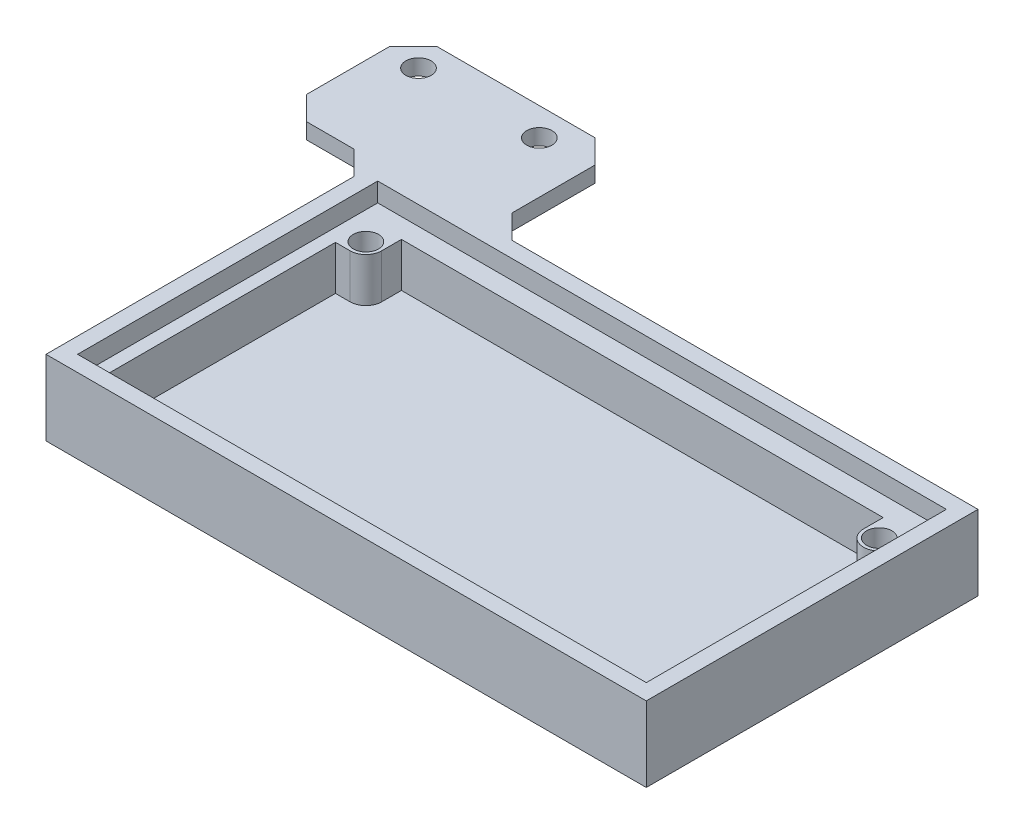
ISO-10303-21;
HEADER;
FILE_DESCRIPTION(('STEP AP214'),'2;1');
FILE_NAME('part.step','',(''),(''),'','','');
FILE_SCHEMA(('AUTOMOTIVE_DESIGN { 1 0 10303 214 1 1 1 1 }'));
ENDSEC;
DATA;
#1=APPLICATION_CONTEXT('core data for automotive mechanical design processes');
#2=APPLICATION_PROTOCOL_DEFINITION('international standard','automotive_design',2000,#1);
#3=PRODUCT_CONTEXT('',#1,'mechanical');
#4=PRODUCT('Part','Part','',(#3));
#5=PRODUCT_RELATED_PRODUCT_CATEGORY('part','',(#4));
#6=PRODUCT_DEFINITION_FORMATION('','',#4);
#7=PRODUCT_DEFINITION_CONTEXT('part definition',#1,'design');
#8=PRODUCT_DEFINITION('design','',#6,#7);
#9=PRODUCT_DEFINITION_SHAPE('','',#8);
#10=(LENGTH_UNIT() NAMED_UNIT(*) SI_UNIT(.MILLI.,.METRE.));
#11=(NAMED_UNIT(*) PLANE_ANGLE_UNIT() SI_UNIT($,.RADIAN.));
#12=(NAMED_UNIT(*) SI_UNIT($,.STERADIAN.) SOLID_ANGLE_UNIT());
#13=UNCERTAINTY_MEASURE_WITH_UNIT(LENGTH_MEASURE(1.E-05),#10,'distance_accuracy_value','');
#14=(GEOMETRIC_REPRESENTATION_CONTEXT(3) GLOBAL_UNCERTAINTY_ASSIGNED_CONTEXT((#13)) GLOBAL_UNIT_ASSIGNED_CONTEXT((#10,
#11,#12)) REPRESENTATION_CONTEXT('',''));
#15=CARTESIAN_POINT('',(0.,0.,0.));
#16=DIRECTION('',(0.,0.,1.));
#17=DIRECTION('',(1.,0.,0.));
#18=AXIS2_PLACEMENT_3D('',#15,#16,#17);
#19=CARTESIAN_POINT('',(-38.,8.,-21.));
#20=DIRECTION('',(0.,0.,1.));
#21=DIRECTION('',(1.,0.,0.));
#22=AXIS2_PLACEMENT_3D('',#19,#20,#21);
#23=PLANE('',#22);
#24=DIRECTION('',(1.,0.,0.));
#25=VECTOR('',#24,1.);
#26=CARTESIAN_POINT('',(-24.,3.00000000000001,-21.));
#27=LINE('',#26,#25);
#28=CARTESIAN_POINT('',(-38.,3.00000000000001,-21.));
#29=VERTEX_POINT('',#28);
#30=CARTESIAN_POINT('',(-21.,3.00000000000001,-21.));
#31=VERTEX_POINT('',#30);
#32=EDGE_CURVE('E410',#29,#31,#27,.T.);
#33=ORIENTED_EDGE('',*,*,#32,.T.);
#34=DIRECTION('',(0.,1.,0.));
#35=VECTOR('',#34,1.);
#36=CARTESIAN_POINT('',(-21.,8.,-21.));
#37=LINE('',#36,#35);
#38=CARTESIAN_POINT('',(-21.,8.,-21.));
#39=VERTEX_POINT('',#38);
#40=EDGE_CURVE('E419',#31,#39,#37,.T.);
#41=ORIENTED_EDGE('',*,*,#40,.T.);
#42=DIRECTION('',(-1.,0.,0.));
#43=VECTOR('',#42,1.);
#44=CARTESIAN_POINT('',(-38.,8.,-21.));
#45=LINE('',#44,#43);
#46=CARTESIAN_POINT('',(38.,8.,-21.));
#47=VERTEX_POINT('',#46);
#48=EDGE_CURVE('E392',#47,#39,#45,.T.);
#49=ORIENTED_EDGE('',*,*,#48,.F.);
#50=DIRECTION('',(0.,-1.,0.));
#51=VECTOR('',#50,1.);
#52=CARTESIAN_POINT('',(38.,8.,-21.));
#53=LINE('',#52,#51);
#54=CARTESIAN_POINT('',(38.,-1.5,-21.));
#55=VERTEX_POINT('',#54);
#56=EDGE_CURVE('E401',#47,#55,#53,.T.);
#57=ORIENTED_EDGE('',*,*,#56,.T.);
#58=DIRECTION('',(1.,0.,0.));
#59=VECTOR('',#58,1.);
#60=CARTESIAN_POINT('',(-38.,-1.5,-21.));
#61=LINE('',#60,#59);
#62=CARTESIAN_POINT('',(-38.,-1.5,-21.));
#63=VERTEX_POINT('',#62);
#64=EDGE_CURVE('E360',#63,#55,#61,.T.);
#65=ORIENTED_EDGE('',*,*,#64,.F.);
#66=DIRECTION('',(0.,-1.,0.));
#67=VECTOR('',#66,1.);
#68=CARTESIAN_POINT('',(-38.,8.,-21.));
#69=LINE('',#68,#67);
#70=EDGE_CURVE('E399',#29,#63,#69,.T.);
#71=ORIENTED_EDGE('',*,*,#70,.F.);
#72=EDGE_LOOP('',(#33,#41,#49,#57,#65,#71));
#73=FACE_BOUND('',#72,.T.);
#74=ADVANCED_FACE('F94',(#73),#23,.F.);
#75=CARTESIAN_POINT('',(-36.,8.,19.));
#76=DIRECTION('',(0.,0.,-1.));
#77=DIRECTION('',(-1.,0.,0.));
#78=AXIS2_PLACEMENT_3D('',#75,#76,#77);
#79=PLANE('',#78);
#80=DIRECTION('',(1.,0.,0.));
#81=VECTOR('',#80,1.);
#82=CARTESIAN_POINT('',(-36.,0.,19.));
#83=LINE('',#82,#81);
#84=CARTESIAN_POINT('',(-34.35,0.,19.));
#85=VERTEX_POINT('',#84);
#86=CARTESIAN_POINT('',(34.35,0.,19.));
#87=VERTEX_POINT('',#86);
#88=EDGE_CURVE('E363',#85,#87,#83,.T.);
#89=ORIENTED_EDGE('',*,*,#88,.F.);
#90=DIRECTION('',(0.,1.,0.));
#91=VECTOR('',#90,1.);
#92=CARTESIAN_POINT('',(-34.35,-82.9125297481905,19.));
#93=LINE('',#92,#91);
#94=CARTESIAN_POINT('',(-34.35,5.6,19.));
#95=VERTEX_POINT('',#94);
#96=EDGE_CURVE('E324',#85,#95,#93,.T.);
#97=ORIENTED_EDGE('',*,*,#96,.T.);
#98=DIRECTION('',(-1.,0.,0.));
#99=VECTOR('',#98,1.);
#100=CARTESIAN_POINT('',(0.,5.6,19.));
#101=LINE('',#100,#99);
#102=CARTESIAN_POINT('',(-36.,5.6,19.));
#103=VERTEX_POINT('',#102);
#104=EDGE_CURVE('E323',#95,#103,#101,.T.);
#105=ORIENTED_EDGE('',*,*,#104,.T.);
#106=DIRECTION('',(0.,-1.,0.));
#107=VECTOR('',#106,1.);
#108=CARTESIAN_POINT('',(-36.,8.,19.));
#109=LINE('',#108,#107);
#110=CARTESIAN_POINT('',(-36.,8.,19.));
#111=VERTEX_POINT('',#110);
#112=EDGE_CURVE('E378',#111,#103,#109,.T.);
#113=ORIENTED_EDGE('',*,*,#112,.F.);
#114=DIRECTION('',(1.,0.,0.));
#115=VECTOR('',#114,1.);
#116=CARTESIAN_POINT('',(-36.,8.,19.));
#117=LINE('',#116,#115);
#118=CARTESIAN_POINT('',(36.,8.,19.));
#119=VERTEX_POINT('',#118);
#120=EDGE_CURVE('E371',#111,#119,#117,.T.);
#121=ORIENTED_EDGE('',*,*,#120,.T.);
#122=DIRECTION('',(0.,-1.,0.));
#123=VECTOR('',#122,1.);
#124=CARTESIAN_POINT('',(36.,8.,19.));
#125=LINE('',#124,#123);
#126=CARTESIAN_POINT('',(36.,5.6,19.));
#127=VERTEX_POINT('',#126);
#128=EDGE_CURVE('E373',#119,#127,#125,.T.);
#129=ORIENTED_EDGE('',*,*,#128,.T.);
#130=DIRECTION('',(-1.,0.,0.));
#131=VECTOR('',#130,1.);
#132=CARTESIAN_POINT('',(0.,5.6,19.));
#133=LINE('',#132,#131);
#134=CARTESIAN_POINT('',(34.35,5.6,19.));
#135=VERTEX_POINT('',#134);
#136=EDGE_CURVE('E330',#127,#135,#133,.T.);
#137=ORIENTED_EDGE('',*,*,#136,.T.);
#138=DIRECTION('',(0.,1.,0.));
#139=VECTOR('',#138,1.);
#140=CARTESIAN_POINT('',(34.35,-82.9125297481905,19.));
#141=LINE('',#140,#139);
#142=EDGE_CURVE('E328',#87,#135,#141,.T.);
#143=ORIENTED_EDGE('',*,*,#142,.F.);
#144=EDGE_LOOP('',(#89,#97,#105,#113,#121,#129,#137,#143));
#145=FACE_BOUND('',#144,.T.);
#146=ADVANCED_FACE('F527',(#145),#79,.T.);
#147=CARTESIAN_POINT('',(0.,0.,0.));
#148=DIRECTION('',(0.,-1.,0.));
#149=DIRECTION('',(0.,0.,-1.));
#150=AXIS2_PLACEMENT_3D('',#147,#148,#149);
#151=PLANE('',#150);
#152=DIRECTION('',(0.,0.,-1.));
#153=VECTOR('',#152,1.);
#154=CARTESIAN_POINT('',(-34.35,0.,0.));
#155=LINE('',#154,#153);
#156=CARTESIAN_POINT('',(-34.35,0.,-12.));
#157=VERTEX_POINT('',#156);
#158=EDGE_CURVE('E335',#85,#157,#155,.T.);
#159=ORIENTED_EDGE('',*,*,#158,.F.);
#160=ORIENTED_EDGE('',*,*,#88,.T.);
#161=DIRECTION('',(0.,0.,-1.));
#162=VECTOR('',#161,1.);
#163=CARTESIAN_POINT('',(34.35,0.,0.));
#164=LINE('',#163,#162);
#165=CARTESIAN_POINT('',(34.35,0.,-13.2400657923215));
#166=VERTEX_POINT('',#165);
#167=EDGE_CURVE('E348',#87,#166,#164,.T.);
#168=ORIENTED_EDGE('',*,*,#167,.T.);
#169=CARTESIAN_POINT('',(32.5,0.,-14.));
#170=DIRECTION('',(0.,-1.,0.));
#171=DIRECTION('',(0.,0.,-1.));
#172=AXIS2_PLACEMENT_3D('',#169,#170,#171);
#173=CIRCLE('',#172,2.);
#174=CARTESIAN_POINT('',(30.5,0.,-14.));
#175=VERTEX_POINT('',#174);
#176=EDGE_CURVE('E332',#166,#175,#173,.T.);
#177=ORIENTED_EDGE('',*,*,#176,.T.);
#178=DIRECTION('',(0.,0.,1.));
#179=VECTOR('',#178,1.);
#180=CARTESIAN_POINT('',(30.5,0.,0.));
#181=LINE('',#180,#179);
#182=CARTESIAN_POINT('',(30.5,0.,-16.5));
#183=VERTEX_POINT('',#182);
#184=EDGE_CURVE('E283',#183,#175,#181,.T.);
#185=ORIENTED_EDGE('',*,*,#184,.F.);
#186=DIRECTION('',(-1.,0.,0.));
#187=VECTOR('',#186,1.);
#188=CARTESIAN_POINT('',(0.,0.,-16.5));
#189=LINE('',#188,#187);
#190=CARTESIAN_POINT('',(-30.5,0.,-16.5));
#191=VERTEX_POINT('',#190);
#192=EDGE_CURVE('E345',#183,#191,#189,.T.);
#193=ORIENTED_EDGE('',*,*,#192,.T.);
#194=DIRECTION('',(0.,0.,1.));
#195=VECTOR('',#194,1.);
#196=CARTESIAN_POINT('',(-30.5,0.,0.));
#197=LINE('',#196,#195);
#198=CARTESIAN_POINT('',(-30.5,0.,-14.));
#199=VERTEX_POINT('',#198);
#200=EDGE_CURVE('E342',#191,#199,#197,.T.);
#201=ORIENTED_EDGE('',*,*,#200,.T.);
#202=CARTESIAN_POINT('',(-32.5,0.,-14.));
#203=DIRECTION('',(0.,-1.,0.));
#204=DIRECTION('',(0.,0.,-1.));
#205=AXIS2_PLACEMENT_3D('',#202,#203,#204);
#206=CIRCLE('',#205,2.);
#207=CARTESIAN_POINT('',(-32.5,0.,-12.));
#208=VERTEX_POINT('',#207);
#209=EDGE_CURVE('E339',#199,#208,#206,.T.);
#210=ORIENTED_EDGE('',*,*,#209,.T.);
#211=DIRECTION('',(1.,0.,0.));
#212=VECTOR('',#211,1.);
#213=CARTESIAN_POINT('',(0.,0.,-12.));
#214=LINE('',#213,#212);
#215=EDGE_CURVE('E337',#157,#208,#214,.T.);
#216=ORIENTED_EDGE('',*,*,#215,.F.);
#217=EDGE_LOOP('',(#159,#160,#168,#177,#185,#193,#201,#210,#216));
#218=FACE_BOUND('',#217,.T.);
#219=ADVANCED_FACE('F549',(#218),#151,.F.);
#220=CARTESIAN_POINT('',(0.,8.,0.));
#221=DIRECTION('',(0.,1.,0.));
#222=DIRECTION('',(0.,0.,1.));
#223=AXIS2_PLACEMENT_3D('',#220,#221,#222);
#224=PLANE('',#223);
#225=CARTESIAN_POINT('',(-30.5,8.,-33.96));
#226=DIRECTION('',(0.,1.,0.));
#227=DIRECTION('',(0.,0.,1.));
#228=AXIS2_PLACEMENT_3D('',#225,#226,#227);
#229=CIRCLE('',#228,1.6);
#230=CARTESIAN_POINT('',(-30.5,8.,-32.36));
#231=VERTEX_POINT('',#230);
#232=EDGE_CURVE('E460',#231,#231,#229,.T.);
#233=ORIENTED_EDGE('',*,*,#232,.F.);
#234=EDGE_LOOP('',(#233));
#235=FACE_BOUND('',#234,.T.);
#236=CARTESIAN_POINT('',(-45.8,8.,-33.96));
#237=DIRECTION('',(0.,1.,0.));
#238=DIRECTION('',(0.,0.,1.));
#239=AXIS2_PLACEMENT_3D('',#236,#237,#238);
#240=CIRCLE('',#239,1.6);
#241=CARTESIAN_POINT('',(-45.8,8.,-32.36));
#242=VERTEX_POINT('',#241);
#243=EDGE_CURVE('E456',#242,#242,#240,.T.);
#244=ORIENTED_EDGE('',*,*,#243,.F.);
#245=EDGE_LOOP('',(#244));
#246=FACE_BOUND('',#245,.T.);
#247=DIRECTION('',(0.,0.,1.));
#248=VECTOR('',#247,1.);
#249=CARTESIAN_POINT('',(-24.,8.,-37.5));
#250=LINE('',#249,#248);
#251=CARTESIAN_POINT('',(-24.,8.,-34.5));
#252=VERTEX_POINT('',#251);
#253=CARTESIAN_POINT('',(-24.,8.,-24.0000000000001));
#254=VERTEX_POINT('',#253);
#255=EDGE_CURVE('E487',#252,#254,#250,.T.);
#256=ORIENTED_EDGE('',*,*,#255,.F.);
#257=DIRECTION('',(0.707106781186546,0.,0.707106781186549));
#258=VECTOR('',#257,1.);
#259=CARTESIAN_POINT('',(5.24999999999993,8.,-5.24999999999991));
#260=LINE('',#259,#258);
#261=CARTESIAN_POINT('',(-27.,8.,-37.5));
#262=VERTEX_POINT('',#261);
#263=EDGE_CURVE('E437',#252,#262,#260,.F.);
#264=ORIENTED_EDGE('',*,*,#263,.T.);
#265=DIRECTION('',(1.,0.,0.));
#266=VECTOR('',#265,1.);
#267=CARTESIAN_POINT('',(-24.,8.,-37.5));
#268=LINE('',#267,#266);
#269=CARTESIAN_POINT('',(-47.,8.,-37.5));
#270=VERTEX_POINT('',#269);
#271=EDGE_CURVE('E482',#270,#262,#268,.T.);
#272=ORIENTED_EDGE('',*,*,#271,.F.);
#273=DIRECTION('',(0.707106781186544,0.,-0.707106781186551));
#274=VECTOR('',#273,1.);
#275=CARTESIAN_POINT('',(-42.2500000000002,8.,-42.2499999999998));
#276=LINE('',#275,#274);
#277=CARTESIAN_POINT('',(-50.,8.,-34.5));
#278=VERTEX_POINT('',#277);
#279=EDGE_CURVE('E435',#270,#278,#276,.F.);
#280=ORIENTED_EDGE('',*,*,#279,.T.);
#281=DIRECTION('',(0.,0.,1.));
#282=VECTOR('',#281,1.);
#283=CARTESIAN_POINT('',(-50.,8.,-37.5));
#284=LINE('',#283,#282);
#285=CARTESIAN_POINT('',(-50.,8.,-24.));
#286=VERTEX_POINT('',#285);
#287=EDGE_CURVE('E490',#278,#286,#284,.T.);
#288=ORIENTED_EDGE('',*,*,#287,.T.);
#289=DIRECTION('',(0.707106781186549,0.,0.707106781186546));
#290=VECTOR('',#289,1.);
#291=CARTESIAN_POINT('',(-12.9999999999999,8.,12.9999999999999));
#292=LINE('',#291,#290);
#293=CARTESIAN_POINT('',(-47.,8.,-21.));
#294=VERTEX_POINT('',#293);
#295=EDGE_CURVE('E433',#286,#294,#292,.T.);
#296=ORIENTED_EDGE('',*,*,#295,.T.);
#297=DIRECTION('',(1.,0.,0.));
#298=VECTOR('',#297,1.);
#299=CARTESIAN_POINT('',(-24.,8.,-21.));
#300=LINE('',#299,#298);
#301=CARTESIAN_POINT('',(-41.,8.,-21.));
#302=VERTEX_POINT('',#301);
#303=EDGE_CURVE('E475',#294,#302,#300,.T.);
#304=ORIENTED_EDGE('',*,*,#303,.T.);
#305=DIRECTION('',(0.707106781186544,0.,0.707106781186551));
#306=VECTOR('',#305,1.);
#307=CARTESIAN_POINT('',(-38.,8.,-18.));
#308=LINE('',#307,#306);
#309=CARTESIAN_POINT('',(-38.,8.,-18.));
#310=VERTEX_POINT('',#309);
#311=EDGE_CURVE('E12',#302,#310,#308,.T.);
#312=ORIENTED_EDGE('',*,*,#311,.T.);
#313=DIRECTION('',(0.,0.,1.));
#314=VECTOR('',#313,1.);
#315=CARTESIAN_POINT('',(-38.,8.,21.));
#316=LINE('',#315,#314);
#317=CARTESIAN_POINT('',(-38.,8.,21.));
#318=VERTEX_POINT('',#317);
#319=EDGE_CURVE('E395',#310,#318,#316,.T.);
#320=ORIENTED_EDGE('',*,*,#319,.T.);
#321=DIRECTION('',(1.,0.,0.));
#322=VECTOR('',#321,1.);
#323=CARTESIAN_POINT('',(-38.,8.,21.));
#324=LINE('',#323,#322);
#325=CARTESIAN_POINT('',(38.,8.,21.));
#326=VERTEX_POINT('',#325);
#327=EDGE_CURVE('E387',#318,#326,#324,.T.);
#328=ORIENTED_EDGE('',*,*,#327,.T.);
#329=DIRECTION('',(0.,0.,-1.));
#330=VECTOR('',#329,1.);
#331=CARTESIAN_POINT('',(38.,8.,21.));
#332=LINE('',#331,#330);
#333=EDGE_CURVE('E390',#326,#47,#332,.T.);
#334=ORIENTED_EDGE('',*,*,#333,.T.);
#335=ORIENTED_EDGE('',*,*,#48,.T.);
#336=DIRECTION('',(0.707106781186544,0.,0.707106781186551));
#337=VECTOR('',#336,1.);
#338=CARTESIAN_POINT('',(-24.,8.,-24.0000000000001));
#339=LINE('',#338,#337);
#340=EDGE_CURVE('E450',#39,#254,#339,.F.);
#341=ORIENTED_EDGE('',*,*,#340,.T.);
#342=EDGE_LOOP('',(#256,#264,#272,#280,#288,#296,#304,#312,#320,#328,#334,#335,#341));
#343=FACE_BOUND('',#342,.T.);
#344=DIRECTION('',(-1.,0.,0.));
#345=VECTOR('',#344,1.);
#346=CARTESIAN_POINT('',(-36.,8.,-19.));
#347=LINE('',#346,#345);
#348=CARTESIAN_POINT('',(36.,8.,-19.));
#349=VERTEX_POINT('',#348);
#350=CARTESIAN_POINT('',(-36.,8.,-19.));
#351=VERTEX_POINT('',#350);
#352=EDGE_CURVE('E366',#349,#351,#347,.T.);
#353=ORIENTED_EDGE('',*,*,#352,.F.);
#354=DIRECTION('',(0.,0.,-1.));
#355=VECTOR('',#354,1.);
#356=CARTESIAN_POINT('',(36.,8.,19.));
#357=LINE('',#356,#355);
#358=EDGE_CURVE('E364',#119,#349,#357,.T.);
#359=ORIENTED_EDGE('',*,*,#358,.F.);
#360=ORIENTED_EDGE('',*,*,#120,.F.);
#361=DIRECTION('',(0.,0.,1.));
#362=VECTOR('',#361,1.);
#363=CARTESIAN_POINT('',(-36.,8.,19.));
#364=LINE('',#363,#362);
#365=EDGE_CURVE('E368',#351,#111,#364,.T.);
#366=ORIENTED_EDGE('',*,*,#365,.F.);
#367=EDGE_LOOP('',(#353,#359,#360,#366));
#368=FACE_BOUND('',#367,.T.);
#369=ADVANCED_FACE('F473',(#235,#246,#343,#368),#224,.T.);
#370=CARTESIAN_POINT('',(-38.,8.,21.));
#371=DIRECTION('',(0.,0.,-1.));
#372=DIRECTION('',(-1.,0.,0.));
#373=AXIS2_PLACEMENT_3D('',#370,#371,#372);
#374=PLANE('',#373);
#375=DIRECTION('',(0.,-1.,0.));
#376=VECTOR('',#375,1.);
#377=CARTESIAN_POINT('',(-38.,8.,21.));
#378=LINE('',#377,#376);
#379=CARTESIAN_POINT('',(-38.,-1.5,21.));
#380=VERTEX_POINT('',#379);
#381=EDGE_CURVE('E397',#318,#380,#378,.T.);
#382=ORIENTED_EDGE('',*,*,#381,.T.);
#383=DIRECTION('',(-1.,0.,0.));
#384=VECTOR('',#383,1.);
#385=CARTESIAN_POINT('',(38.,-1.5,21.));
#386=LINE('',#385,#384);
#387=CARTESIAN_POINT('',(38.,-1.5,21.));
#388=VERTEX_POINT('',#387);
#389=EDGE_CURVE('E354',#388,#380,#386,.T.);
#390=ORIENTED_EDGE('',*,*,#389,.F.);
#391=DIRECTION('',(0.,-1.,0.));
#392=VECTOR('',#391,1.);
#393=CARTESIAN_POINT('',(38.,8.,21.));
#394=LINE('',#393,#392);
#395=EDGE_CURVE('E403',#326,#388,#394,.T.);
#396=ORIENTED_EDGE('',*,*,#395,.F.);
#397=ORIENTED_EDGE('',*,*,#327,.F.);
#398=EDGE_LOOP('',(#382,#390,#396,#397));
#399=FACE_BOUND('',#398,.T.);
#400=ADVANCED_FACE('F592',(#399),#374,.F.);
#401=CARTESIAN_POINT('',(38.,8.,21.));
#402=DIRECTION('',(-1.,0.,0.));
#403=DIRECTION('',(0.,0.,1.));
#404=AXIS2_PLACEMENT_3D('',#401,#402,#403);
#405=PLANE('',#404);
#406=ORIENTED_EDGE('',*,*,#395,.T.);
#407=DIRECTION('',(0.,0.,1.));
#408=VECTOR('',#407,1.);
#409=CARTESIAN_POINT('',(38.,-1.5,-21.));
#410=LINE('',#409,#408);
#411=EDGE_CURVE('E351',#55,#388,#410,.T.);
#412=ORIENTED_EDGE('',*,*,#411,.F.);
#413=ORIENTED_EDGE('',*,*,#56,.F.);
#414=ORIENTED_EDGE('',*,*,#333,.F.);
#415=EDGE_LOOP('',(#406,#412,#413,#414));
#416=FACE_BOUND('',#415,.T.);
#417=ADVANCED_FACE('F589',(#416),#405,.F.);
#418=CARTESIAN_POINT('',(-38.,8.,21.));
#419=DIRECTION('',(1.,0.,0.));
#420=DIRECTION('',(0.,0.,-1.));
#421=AXIS2_PLACEMENT_3D('',#418,#419,#420);
#422=PLANE('',#421);
#423=ORIENTED_EDGE('',*,*,#319,.F.);
#424=DIRECTION('',(0.,-1.,0.));
#425=VECTOR('',#424,1.);
#426=CARTESIAN_POINT('',(-38.,8.,-18.));
#427=LINE('',#426,#425);
#428=CARTESIAN_POINT('',(-38.,6.,-18.));
#429=VERTEX_POINT('',#428);
#430=EDGE_CURVE('E452',#310,#429,#427,.T.);
#431=ORIENTED_EDGE('',*,*,#430,.T.);
#432=DIRECTION('',(0.,0.,1.));
#433=VECTOR('',#432,1.);
#434=CARTESIAN_POINT('',(-38.,6.,21.));
#435=LINE('',#434,#433);
#436=CARTESIAN_POINT('',(-38.,6.,-24.));
#437=VERTEX_POINT('',#436);
#438=EDGE_CURVE('E405',#437,#429,#435,.T.);
#439=ORIENTED_EDGE('',*,*,#438,.F.);
#440=DIRECTION('',(0.,0.707106781186544,-0.707106781186551));
#441=VECTOR('',#440,1.);
#442=CARTESIAN_POINT('',(-38.,-15.5,-2.4999999999998));
#443=LINE('',#442,#441);
#444=EDGE_CURVE('E412',#437,#29,#443,.F.);
#445=ORIENTED_EDGE('',*,*,#444,.T.);
#446=ORIENTED_EDGE('',*,*,#70,.T.);
#447=DIRECTION('',(0.,0.,-1.));
#448=VECTOR('',#447,1.);
#449=CARTESIAN_POINT('',(-38.,-1.5,21.));
#450=LINE('',#449,#448);
#451=EDGE_CURVE('E357',#380,#63,#450,.T.);
#452=ORIENTED_EDGE('',*,*,#451,.F.);
#453=ORIENTED_EDGE('',*,*,#381,.F.);
#454=EDGE_LOOP('',(#423,#431,#439,#445,#446,#452,#453));
#455=FACE_BOUND('',#454,.T.);
#456=ADVANCED_FACE('F467',(#455),#422,.F.);
#457=CARTESIAN_POINT('',(36.,8.,19.));
#458=DIRECTION('',(-1.,0.,0.));
#459=DIRECTION('',(0.,0.,1.));
#460=AXIS2_PLACEMENT_3D('',#457,#458,#459);
#461=PLANE('',#460);
#462=DIRECTION('',(0.,0.,1.));
#463=VECTOR('',#462,1.);
#464=CARTESIAN_POINT('',(36.,5.6,0.));
#465=LINE('',#464,#463);
#466=CARTESIAN_POINT('',(36.,5.6,-19.));
#467=VERTEX_POINT('',#466);
#468=EDGE_CURVE('E521',#467,#127,#465,.T.);
#469=ORIENTED_EDGE('',*,*,#468,.T.);
#470=ORIENTED_EDGE('',*,*,#128,.F.);
#471=ORIENTED_EDGE('',*,*,#358,.T.);
#472=DIRECTION('',(0.,-1.,0.));
#473=VECTOR('',#472,1.);
#474=CARTESIAN_POINT('',(36.,8.,-19.));
#475=LINE('',#474,#473);
#476=EDGE_CURVE('E384',#349,#467,#475,.T.);
#477=ORIENTED_EDGE('',*,*,#476,.T.);
#478=EDGE_LOOP('',(#469,#470,#471,#477));
#479=FACE_BOUND('',#478,.T.);
#480=ADVANCED_FACE('F530',(#479),#461,.T.);
#481=CARTESIAN_POINT('',(-36.,8.,-19.));
#482=DIRECTION('',(0.,0.,1.));
#483=DIRECTION('',(1.,0.,0.));
#484=AXIS2_PLACEMENT_3D('',#481,#482,#483);
#485=PLANE('',#484);
#486=DIRECTION('',(1.,0.,0.));
#487=VECTOR('',#486,1.);
#488=CARTESIAN_POINT('',(0.,5.6,-19.));
#489=LINE('',#488,#487);
#490=CARTESIAN_POINT('',(-36.,5.6,-19.));
#491=VERTEX_POINT('',#490);
#492=EDGE_CURVE('E518',#491,#467,#489,.T.);
#493=ORIENTED_EDGE('',*,*,#492,.T.);
#494=ORIENTED_EDGE('',*,*,#476,.F.);
#495=ORIENTED_EDGE('',*,*,#352,.T.);
#496=DIRECTION('',(0.,-1.,0.));
#497=VECTOR('',#496,1.);
#498=CARTESIAN_POINT('',(-36.,8.,-19.));
#499=LINE('',#498,#497);
#500=EDGE_CURVE('E381',#351,#491,#499,.T.);
#501=ORIENTED_EDGE('',*,*,#500,.T.);
#502=EDGE_LOOP('',(#493,#494,#495,#501));
#503=FACE_BOUND('',#502,.T.);
#504=ADVANCED_FACE('F535',(#503),#485,.T.);
#505=CARTESIAN_POINT('',(-36.,8.,19.));
#506=DIRECTION('',(1.,0.,0.));
#507=DIRECTION('',(0.,0.,-1.));
#508=AXIS2_PLACEMENT_3D('',#505,#506,#507);
#509=PLANE('',#508);
#510=DIRECTION('',(0.,0.,-1.));
#511=VECTOR('',#510,1.);
#512=CARTESIAN_POINT('',(-36.,5.6,0.));
#513=LINE('',#512,#511);
#514=EDGE_CURVE('E327',#103,#491,#513,.T.);
#515=ORIENTED_EDGE('',*,*,#514,.T.);
#516=ORIENTED_EDGE('',*,*,#500,.F.);
#517=ORIENTED_EDGE('',*,*,#365,.T.);
#518=ORIENTED_EDGE('',*,*,#112,.T.);
#519=EDGE_LOOP('',(#515,#516,#517,#518));
#520=FACE_BOUND('',#519,.T.);
#521=ADVANCED_FACE('F540',(#520),#509,.T.);
#522=CARTESIAN_POINT('',(0.,-1.5,0.));
#523=DIRECTION('',(0.,-1.,0.));
#524=DIRECTION('',(0.,0.,-1.));
#525=AXIS2_PLACEMENT_3D('',#522,#523,#524);
#526=PLANE('',#525);
#527=CARTESIAN_POINT('',(32.5,-1.5,-14.));
#528=DIRECTION('',(0.,-1.,0.));
#529=DIRECTION('',(0.,0.,-1.));
#530=AXIS2_PLACEMENT_3D('',#527,#528,#529);
#531=CIRCLE('',#530,1.6);
#532=CARTESIAN_POINT('',(32.5,-1.5,-15.6));
#533=VERTEX_POINT('',#532);
#534=EDGE_CURVE('E303',#533,#533,#531,.T.);
#535=ORIENTED_EDGE('',*,*,#534,.F.);
#536=EDGE_LOOP('',(#535));
#537=FACE_BOUND('',#536,.T.);
#538=CARTESIAN_POINT('',(-32.5,-1.5,-14.));
#539=DIRECTION('',(0.,-1.,0.));
#540=DIRECTION('',(0.,0.,-1.));
#541=AXIS2_PLACEMENT_3D('',#538,#539,#540);
#542=CIRCLE('',#541,1.6);
#543=CARTESIAN_POINT('',(-32.5,-1.5,-15.6));
#544=VERTEX_POINT('',#543);
#545=EDGE_CURVE('E308',#544,#544,#542,.T.);
#546=ORIENTED_EDGE('',*,*,#545,.F.);
#547=EDGE_LOOP('',(#546));
#548=FACE_BOUND('',#547,.T.);
#549=ORIENTED_EDGE('',*,*,#411,.T.);
#550=ORIENTED_EDGE('',*,*,#389,.T.);
#551=ORIENTED_EDGE('',*,*,#451,.T.);
#552=ORIENTED_EDGE('',*,*,#64,.T.);
#553=EDGE_LOOP('',(#549,#550,#551,#552));
#554=FACE_BOUND('',#553,.T.);
#555=ADVANCED_FACE('F567',(#537,#548,#554),#526,.T.);
#556=CARTESIAN_POINT('',(34.35,-82.9125297481905,0.));
#557=DIRECTION('',(-1.,0.,0.));
#558=DIRECTION('',(0.,0.,1.));
#559=AXIS2_PLACEMENT_3D('',#556,#557,#558);
#560=PLANE('',#559);
#561=ORIENTED_EDGE('',*,*,#167,.F.);
#562=ORIENTED_EDGE('',*,*,#142,.T.);
#563=DIRECTION('',(0.,0.,1.));
#564=VECTOR('',#563,1.);
#565=CARTESIAN_POINT('',(34.35,5.6,0.));
#566=LINE('',#565,#564);
#567=CARTESIAN_POINT('',(34.35,5.6,-13.2400657923215));
#568=VERTEX_POINT('',#567);
#569=EDGE_CURVE('E302',#568,#135,#566,.T.);
#570=ORIENTED_EDGE('',*,*,#569,.F.);
#571=DIRECTION('',(0.,1.,0.));
#572=VECTOR('',#571,1.);
#573=CARTESIAN_POINT('',(34.35,-82.9125297481905,-13.2400657923215));
#574=LINE('',#573,#572);
#575=EDGE_CURVE('E297',#166,#568,#574,.T.);
#576=ORIENTED_EDGE('',*,*,#575,.F.);
#577=EDGE_LOOP('',(#561,#562,#570,#576));
#578=FACE_BOUND('',#577,.T.);
#579=ADVANCED_FACE('F565',(#578),#560,.T.);
#580=CARTESIAN_POINT('',(0.,-82.9125297481905,-16.5));
#581=DIRECTION('',(0.,0.,1.));
#582=DIRECTION('',(1.,0.,0.));
#583=AXIS2_PLACEMENT_3D('',#580,#581,#582);
#584=PLANE('',#583);
#585=ORIENTED_EDGE('',*,*,#192,.F.);
#586=DIRECTION('',(0.,1.,0.));
#587=VECTOR('',#586,1.);
#588=CARTESIAN_POINT('',(30.5,-82.9125297481905,-16.5));
#589=LINE('',#588,#587);
#590=CARTESIAN_POINT('',(30.5,5.6,-16.5));
#591=VERTEX_POINT('',#590);
#592=EDGE_CURVE('E287',#183,#591,#589,.T.);
#593=ORIENTED_EDGE('',*,*,#592,.T.);
#594=DIRECTION('',(1.,0.,0.));
#595=VECTOR('',#594,1.);
#596=CARTESIAN_POINT('',(0.,5.6,-16.5));
#597=LINE('',#596,#595);
#598=CARTESIAN_POINT('',(-30.5,5.6,-16.5));
#599=VERTEX_POINT('',#598);
#600=EDGE_CURVE('E296',#599,#591,#597,.T.);
#601=ORIENTED_EDGE('',*,*,#600,.F.);
#602=DIRECTION('',(0.,1.,0.));
#603=VECTOR('',#602,1.);
#604=CARTESIAN_POINT('',(-30.5,-82.9125297481905,-16.5));
#605=LINE('',#604,#603);
#606=EDGE_CURVE('E313',#191,#599,#605,.T.);
#607=ORIENTED_EDGE('',*,*,#606,.F.);
#608=EDGE_LOOP('',(#585,#593,#601,#607));
#609=FACE_BOUND('',#608,.T.);
#610=ADVANCED_FACE('F563',(#609),#584,.T.);
#611=CARTESIAN_POINT('',(-30.5,-82.9125297481905,0.));
#612=DIRECTION('',(1.,0.,0.));
#613=DIRECTION('',(0.,0.,-1.));
#614=AXIS2_PLACEMENT_3D('',#611,#612,#613);
#615=PLANE('',#614);
#616=ORIENTED_EDGE('',*,*,#200,.F.);
#617=ORIENTED_EDGE('',*,*,#606,.T.);
#618=DIRECTION('',(0.,0.,-1.));
#619=VECTOR('',#618,1.);
#620=CARTESIAN_POINT('',(-30.5,5.6,0.));
#621=LINE('',#620,#619);
#622=CARTESIAN_POINT('',(-30.5,5.6,-14.));
#623=VERTEX_POINT('',#622);
#624=EDGE_CURVE('E507',#623,#599,#621,.T.);
#625=ORIENTED_EDGE('',*,*,#624,.F.);
#626=DIRECTION('',(0.,1.,0.));
#627=VECTOR('',#626,1.);
#628=CARTESIAN_POINT('',(-30.5,-82.9125297481905,-14.));
#629=LINE('',#628,#627);
#630=EDGE_CURVE('E315',#199,#623,#629,.T.);
#631=ORIENTED_EDGE('',*,*,#630,.F.);
#632=EDGE_LOOP('',(#616,#617,#625,#631));
#633=FACE_BOUND('',#632,.T.);
#634=ADVANCED_FACE('F560',(#633),#615,.T.);
#635=CARTESIAN_POINT('',(-32.5,-82.9125297481905,-14.));
#636=DIRECTION('',(0.,1.,0.));
#637=DIRECTION('',(0.,0.,1.));
#638=AXIS2_PLACEMENT_3D('',#635,#636,#637);
#639=CYLINDRICAL_SURFACE('',#638,2.);
#640=ORIENTED_EDGE('',*,*,#209,.F.);
#641=ORIENTED_EDGE('',*,*,#630,.T.);
#642=CARTESIAN_POINT('',(-32.5,5.6,-14.));
#643=DIRECTION('',(0.,1.,0.));
#644=DIRECTION('',(0.,0.,1.));
#645=AXIS2_PLACEMENT_3D('',#642,#643,#644);
#646=CIRCLE('',#645,2.);
#647=CARTESIAN_POINT('',(-32.5,5.6,-12.));
#648=VERTEX_POINT('',#647);
#649=EDGE_CURVE('E305',#648,#623,#646,.T.);
#650=ORIENTED_EDGE('',*,*,#649,.F.);
#651=DIRECTION('',(0.,1.,0.));
#652=VECTOR('',#651,1.);
#653=CARTESIAN_POINT('',(-32.5,-82.9125297481905,-12.));
#654=LINE('',#653,#652);
#655=EDGE_CURVE('E318',#208,#648,#654,.T.);
#656=ORIENTED_EDGE('',*,*,#655,.F.);
#657=EDGE_LOOP('',(#640,#641,#650,#656));
#658=FACE_BOUND('',#657,.T.);
#659=ADVANCED_FACE('F556',(#658),#639,.T.);
#660=CARTESIAN_POINT('',(0.,-82.9125297481905,-12.));
#661=DIRECTION('',(0.,0.,-1.));
#662=DIRECTION('',(-1.,0.,0.));
#663=AXIS2_PLACEMENT_3D('',#660,#661,#662);
#664=PLANE('',#663);
#665=DIRECTION('',(0.,1.,0.));
#666=VECTOR('',#665,1.);
#667=CARTESIAN_POINT('',(-34.35,-82.9125297481905,-12.));
#668=LINE('',#667,#666);
#669=CARTESIAN_POINT('',(-34.35,5.6,-12.));
#670=VERTEX_POINT('',#669);
#671=EDGE_CURVE('E321',#157,#670,#668,.T.);
#672=ORIENTED_EDGE('',*,*,#671,.F.);
#673=ORIENTED_EDGE('',*,*,#215,.T.);
#674=ORIENTED_EDGE('',*,*,#655,.T.);
#675=DIRECTION('',(-1.,0.,0.));
#676=VECTOR('',#675,1.);
#677=CARTESIAN_POINT('',(0.,5.6,-12.));
#678=LINE('',#677,#676);
#679=EDGE_CURVE('E317',#648,#670,#678,.T.);
#680=ORIENTED_EDGE('',*,*,#679,.T.);
#681=EDGE_LOOP('',(#672,#673,#674,#680));
#682=FACE_BOUND('',#681,.T.);
#683=ADVANCED_FACE('F552',(#682),#664,.F.);
#684=CARTESIAN_POINT('',(-34.35,-82.9125297481905,0.));
#685=DIRECTION('',(-1.,0.,0.));
#686=DIRECTION('',(0.,0.,1.));
#687=AXIS2_PLACEMENT_3D('',#684,#685,#686);
#688=PLANE('',#687);
#689=ORIENTED_EDGE('',*,*,#96,.F.);
#690=ORIENTED_EDGE('',*,*,#158,.T.);
#691=ORIENTED_EDGE('',*,*,#671,.T.);
#692=DIRECTION('',(0.,0.,1.));
#693=VECTOR('',#692,1.);
#694=CARTESIAN_POINT('',(-34.35,5.6,0.));
#695=LINE('',#694,#693);
#696=EDGE_CURVE('E320',#670,#95,#695,.T.);
#697=ORIENTED_EDGE('',*,*,#696,.T.);
#698=EDGE_LOOP('',(#689,#690,#691,#697));
#699=FACE_BOUND('',#698,.T.);
#700=ADVANCED_FACE('F545',(#699),#688,.F.);
#701=CARTESIAN_POINT('',(30.5,-82.9125297481905,0.));
#702=DIRECTION('',(1.,0.,0.));
#703=DIRECTION('',(0.,0.,-1.));
#704=AXIS2_PLACEMENT_3D('',#701,#702,#703);
#705=PLANE('',#704);
#706=ORIENTED_EDGE('',*,*,#592,.F.);
#707=ORIENTED_EDGE('',*,*,#184,.T.);
#708=DIRECTION('',(0.,1.,0.));
#709=VECTOR('',#708,1.);
#710=CARTESIAN_POINT('',(30.5,-82.9125297481905,-14.));
#711=LINE('',#710,#709);
#712=CARTESIAN_POINT('',(30.5,5.6,-14.));
#713=VERTEX_POINT('',#712);
#714=EDGE_CURVE('E276',#175,#713,#711,.T.);
#715=ORIENTED_EDGE('',*,*,#714,.T.);
#716=DIRECTION('',(0.,0.,-1.));
#717=VECTOR('',#716,1.);
#718=CARTESIAN_POINT('',(30.5,5.6,0.));
#719=LINE('',#718,#717);
#720=EDGE_CURVE('E280',#713,#591,#719,.T.);
#721=ORIENTED_EDGE('',*,*,#720,.T.);
#722=EDGE_LOOP('',(#706,#707,#715,#721));
#723=FACE_BOUND('',#722,.T.);
#724=ADVANCED_FACE('F279',(#723),#705,.F.);
#725=CARTESIAN_POINT('',(32.5,-82.9125297481905,-14.));
#726=DIRECTION('',(0.,1.,0.));
#727=DIRECTION('',(0.,0.,1.));
#728=AXIS2_PLACEMENT_3D('',#725,#726,#727);
#729=CYLINDRICAL_SURFACE('',#728,2.);
#730=ORIENTED_EDGE('',*,*,#176,.F.);
#731=ORIENTED_EDGE('',*,*,#575,.T.);
#732=CARTESIAN_POINT('',(32.5,5.6,-14.));
#733=DIRECTION('',(0.,1.,0.));
#734=DIRECTION('',(0.,0.,1.));
#735=AXIS2_PLACEMENT_3D('',#732,#733,#734);
#736=CIRCLE('',#735,2.);
#737=EDGE_CURVE('E293',#713,#568,#736,.T.);
#738=ORIENTED_EDGE('',*,*,#737,.F.);
#739=ORIENTED_EDGE('',*,*,#714,.F.);
#740=EDGE_LOOP('',(#730,#731,#738,#739));
#741=FACE_BOUND('',#740,.T.);
#742=ADVANCED_FACE('F299',(#741),#729,.T.);
#743=CARTESIAN_POINT('',(0.,5.6,0.));
#744=DIRECTION('',(0.,1.,0.));
#745=DIRECTION('',(0.,0.,1.));
#746=AXIS2_PLACEMENT_3D('',#743,#744,#745);
#747=PLANE('',#746);
#748=CARTESIAN_POINT('',(32.5,5.6,-14.));
#749=DIRECTION('',(0.,1.,0.));
#750=DIRECTION('',(0.,0.,1.));
#751=AXIS2_PLACEMENT_3D('',#748,#749,#750);
#752=CIRCLE('',#751,1.6);
#753=CARTESIAN_POINT('',(32.5,5.6,-12.4));
#754=VERTEX_POINT('',#753);
#755=EDGE_CURVE('E499',#754,#754,#752,.T.);
#756=ORIENTED_EDGE('',*,*,#755,.F.);
#757=EDGE_LOOP('',(#756));
#758=FACE_BOUND('',#757,.T.);
#759=CARTESIAN_POINT('',(-32.5,5.6,-14.));
#760=DIRECTION('',(0.,1.,0.));
#761=DIRECTION('',(0.,0.,1.));
#762=AXIS2_PLACEMENT_3D('',#759,#760,#761);
#763=CIRCLE('',#762,1.6);
#764=CARTESIAN_POINT('',(-32.5,5.6,-12.4));
#765=VERTEX_POINT('',#764);
#766=EDGE_CURVE('E498',#765,#765,#763,.T.);
#767=ORIENTED_EDGE('',*,*,#766,.F.);
#768=EDGE_LOOP('',(#767));
#769=FACE_BOUND('',#768,.T.);
#770=ORIENTED_EDGE('',*,*,#737,.T.);
#771=ORIENTED_EDGE('',*,*,#569,.T.);
#772=ORIENTED_EDGE('',*,*,#136,.F.);
#773=ORIENTED_EDGE('',*,*,#468,.F.);
#774=ORIENTED_EDGE('',*,*,#492,.F.);
#775=ORIENTED_EDGE('',*,*,#514,.F.);
#776=ORIENTED_EDGE('',*,*,#104,.F.);
#777=ORIENTED_EDGE('',*,*,#696,.F.);
#778=ORIENTED_EDGE('',*,*,#679,.F.);
#779=ORIENTED_EDGE('',*,*,#649,.T.);
#780=ORIENTED_EDGE('',*,*,#624,.T.);
#781=ORIENTED_EDGE('',*,*,#600,.T.);
#782=ORIENTED_EDGE('',*,*,#720,.F.);
#783=EDGE_LOOP('',(#770,#771,#772,#773,#774,#775,#776,#777,#778,#779,#780,#781,#782));
#784=FACE_BOUND('',#783,.T.);
#785=ADVANCED_FACE('F291',(#758,#769,#784),#747,.T.);
#786=CARTESIAN_POINT('',(-32.5,-4.4,-14.));
#787=DIRECTION('',(0.,1.,0.));
#788=DIRECTION('',(0.,0.,1.));
#789=AXIS2_PLACEMENT_3D('',#786,#787,#788);
#790=CYLINDRICAL_SURFACE('',#789,1.6);
#791=ORIENTED_EDGE('',*,*,#545,.T.);
#792=EDGE_LOOP('',(#791));
#793=FACE_BOUND('',#792,.T.);
#794=ORIENTED_EDGE('',*,*,#766,.T.);
#795=EDGE_LOOP('',(#794));
#796=FACE_BOUND('',#795,.T.);
#797=ADVANCED_FACE('F720',(#793,#796),#790,.F.);
#798=CARTESIAN_POINT('',(32.5,-4.4,-14.));
#799=DIRECTION('',(0.,1.,0.));
#800=DIRECTION('',(0.,0.,1.));
#801=AXIS2_PLACEMENT_3D('',#798,#799,#800);
#802=CYLINDRICAL_SURFACE('',#801,1.6);
#803=ORIENTED_EDGE('',*,*,#534,.T.);
#804=EDGE_LOOP('',(#803));
#805=FACE_BOUND('',#804,.T.);
#806=ORIENTED_EDGE('',*,*,#755,.T.);
#807=EDGE_LOOP('',(#806));
#808=FACE_BOUND('',#807,.T.);
#809=ADVANCED_FACE('F730',(#805,#808),#802,.F.);
#810=CARTESIAN_POINT('',(0.,0.,-21.));
#811=DIRECTION('',(0.,0.,1.));
#812=DIRECTION('',(1.,0.,0.));
#813=AXIS2_PLACEMENT_3D('',#810,#811,#812);
#814=PLANE('',#813);
#815=DIRECTION('',(-1.,0.,0.));
#816=VECTOR('',#815,1.);
#817=CARTESIAN_POINT('',(-24.,6.,-21.));
#818=LINE('',#817,#816);
#819=CARTESIAN_POINT('',(-41.,6.,-21.));
#820=VERTEX_POINT('',#819);
#821=CARTESIAN_POINT('',(-47.,6.,-21.));
#822=VERTEX_POINT('',#821);
#823=EDGE_CURVE('E479',#820,#822,#818,.T.);
#824=ORIENTED_EDGE('',*,*,#823,.F.);
#825=DIRECTION('',(0.,1.,0.));
#826=VECTOR('',#825,1.);
#827=CARTESIAN_POINT('',(-41.,0.,-21.));
#828=LINE('',#827,#826);
#829=EDGE_CURVE('E116',#820,#302,#828,.T.);
#830=ORIENTED_EDGE('',*,*,#829,.T.);
#831=ORIENTED_EDGE('',*,*,#303,.F.);
#832=DIRECTION('',(0.,-1.,0.));
#833=VECTOR('',#832,1.);
#834=CARTESIAN_POINT('',(-47.,6.,-21.));
#835=LINE('',#834,#833);
#836=EDGE_CURVE('E444',#294,#822,#835,.T.);
#837=ORIENTED_EDGE('',*,*,#836,.T.);
#838=EDGE_LOOP('',(#824,#830,#831,#837));
#839=FACE_BOUND('',#838,.T.);
#840=ADVANCED_FACE('F740',(#839),#814,.T.);
#841=CARTESIAN_POINT('',(-24.,6.,-37.5));
#842=DIRECTION('',(-1.,0.,0.));
#843=DIRECTION('',(0.,0.,1.));
#844=AXIS2_PLACEMENT_3D('',#841,#842,#843);
#845=PLANE('',#844);
#846=ORIENTED_EDGE('',*,*,#255,.T.);
#847=DIRECTION('',(0.,-1.,0.));
#848=VECTOR('',#847,1.);
#849=CARTESIAN_POINT('',(-24.,3.00000000000001,-24.0000000000001));
#850=LINE('',#849,#848);
#851=CARTESIAN_POINT('',(-24.,6.,-24.));
#852=VERTEX_POINT('',#851);
#853=EDGE_CURVE('E416',#254,#852,#850,.T.);
#854=ORIENTED_EDGE('',*,*,#853,.T.);
#855=DIRECTION('',(0.,0.,1.));
#856=VECTOR('',#855,1.);
#857=CARTESIAN_POINT('',(-24.,6.,-37.5));
#858=LINE('',#857,#856);
#859=CARTESIAN_POINT('',(-24.,6.,-34.5));
#860=VERTEX_POINT('',#859);
#861=EDGE_CURVE('E495',#860,#852,#858,.T.);
#862=ORIENTED_EDGE('',*,*,#861,.F.);
#863=DIRECTION('',(0.,1.,0.));
#864=VECTOR('',#863,1.);
#865=CARTESIAN_POINT('',(-24.,6.,-34.5));
#866=LINE('',#865,#864);
#867=EDGE_CURVE('E414',#860,#252,#866,.T.);
#868=ORIENTED_EDGE('',*,*,#867,.T.);
#869=EDGE_LOOP('',(#846,#854,#862,#868));
#870=FACE_BOUND('',#869,.T.);
#871=ADVANCED_FACE('F658',(#870),#845,.F.);
#872=CARTESIAN_POINT('',(-24.,6.,-37.5));
#873=DIRECTION('',(0.,1.,0.));
#874=DIRECTION('',(0.,0.,1.));
#875=AXIS2_PLACEMENT_3D('',#872,#873,#874);
#876=PLANE('',#875);
#877=CARTESIAN_POINT('',(-30.5,6.,-33.96));
#878=DIRECTION('',(0.,1.,0.));
#879=DIRECTION('',(0.,0.,1.));
#880=AXIS2_PLACEMENT_3D('',#877,#878,#879);
#881=CIRCLE('',#880,1.6);
#882=CARTESIAN_POINT('',(-30.5,6.,-32.36));
#883=VERTEX_POINT('',#882);
#884=EDGE_CURVE('E457',#883,#883,#881,.T.);
#885=ORIENTED_EDGE('',*,*,#884,.T.);
#886=EDGE_LOOP('',(#885));
#887=FACE_BOUND('',#886,.T.);
#888=CARTESIAN_POINT('',(-45.8,6.,-33.96));
#889=DIRECTION('',(0.,1.,0.));
#890=DIRECTION('',(0.,0.,1.));
#891=AXIS2_PLACEMENT_3D('',#888,#889,#890);
#892=CIRCLE('',#891,1.6);
#893=CARTESIAN_POINT('',(-45.8,6.,-32.36));
#894=VERTEX_POINT('',#893);
#895=EDGE_CURVE('E453',#894,#894,#892,.T.);
#896=ORIENTED_EDGE('',*,*,#895,.T.);
#897=EDGE_LOOP('',(#896));
#898=FACE_BOUND('',#897,.T.);
#899=DIRECTION('',(-1.,0.,0.));
#900=VECTOR('',#899,1.);
#901=CARTESIAN_POINT('',(-24.,6.,-37.5));
#902=LINE('',#901,#900);
#903=CARTESIAN_POINT('',(-27.,6.,-37.5));
#904=VERTEX_POINT('',#903);
#905=CARTESIAN_POINT('',(-47.,6.,-37.5));
#906=VERTEX_POINT('',#905);
#907=EDGE_CURVE('E478',#904,#906,#902,.T.);
#908=ORIENTED_EDGE('',*,*,#907,.F.);
#909=DIRECTION('',(-0.707106781186546,0.,-0.707106781186549));
#910=VECTOR('',#909,1.);
#911=CARTESIAN_POINT('',(-27.,6.,-37.5));
#912=LINE('',#911,#910);
#913=EDGE_CURVE('E431',#904,#860,#912,.F.);
#914=ORIENTED_EDGE('',*,*,#913,.T.);
#915=ORIENTED_EDGE('',*,*,#861,.T.);
#916=DIRECTION('',(-1.,0.,0.));
#917=VECTOR('',#916,1.);
#918=CARTESIAN_POINT('',(-38.,6.,-24.));
#919=LINE('',#918,#917);
#920=EDGE_CURVE('E407',#852,#437,#919,.T.);
#921=ORIENTED_EDGE('',*,*,#920,.T.);
#922=ORIENTED_EDGE('',*,*,#438,.T.);
#923=DIRECTION('',(-0.707106781186544,0.,-0.707106781186551));
#924=VECTOR('',#923,1.);
#925=CARTESIAN_POINT('',(-40.7500000000001,6.,-20.7500000000001));
#926=LINE('',#925,#924);
#927=EDGE_CURVE('E103',#429,#820,#926,.T.);
#928=ORIENTED_EDGE('',*,*,#927,.T.);
#929=ORIENTED_EDGE('',*,*,#823,.T.);
#930=DIRECTION('',(-0.707106781186549,0.,-0.707106781186546));
#931=VECTOR('',#930,1.);
#932=CARTESIAN_POINT('',(-50.,6.,-24.));
#933=LINE('',#932,#931);
#934=CARTESIAN_POINT('',(-50.,6.,-24.));
#935=VERTEX_POINT('',#934);
#936=EDGE_CURVE('E427',#822,#935,#933,.T.);
#937=ORIENTED_EDGE('',*,*,#936,.T.);
#938=DIRECTION('',(0.,0.,1.));
#939=VECTOR('',#938,1.);
#940=CARTESIAN_POINT('',(-50.,6.,-37.5));
#941=LINE('',#940,#939);
#942=CARTESIAN_POINT('',(-50.,6.,-34.5));
#943=VERTEX_POINT('',#942);
#944=EDGE_CURVE('E492',#943,#935,#941,.T.);
#945=ORIENTED_EDGE('',*,*,#944,.F.);
#946=DIRECTION('',(-0.707106781186544,0.,0.707106781186551));
#947=VECTOR('',#946,1.);
#948=CARTESIAN_POINT('',(-47.,6.,-37.5));
#949=LINE('',#948,#947);
#950=EDGE_CURVE('E429',#943,#906,#949,.F.);
#951=ORIENTED_EDGE('',*,*,#950,.T.);
#952=EDGE_LOOP('',(#908,#914,#915,#921,#922,#928,#929,#937,#945,#951));
#953=FACE_BOUND('',#952,.T.);
#954=ADVANCED_FACE('F642',(#887,#898,#953),#876,.F.);
#955=CARTESIAN_POINT('',(-50.,6.,-37.5));
#956=DIRECTION('',(1.,0.,0.));
#957=DIRECTION('',(0.,0.,-1.));
#958=AXIS2_PLACEMENT_3D('',#955,#956,#957);
#959=PLANE('',#958);
#960=ORIENTED_EDGE('',*,*,#287,.F.);
#961=DIRECTION('',(0.,-1.,0.));
#962=VECTOR('',#961,1.);
#963=CARTESIAN_POINT('',(-50.,6.,-34.5));
#964=LINE('',#963,#962);
#965=EDGE_CURVE('E442',#278,#943,#964,.T.);
#966=ORIENTED_EDGE('',*,*,#965,.T.);
#967=ORIENTED_EDGE('',*,*,#944,.T.);
#968=DIRECTION('',(0.,1.,0.));
#969=VECTOR('',#968,1.);
#970=CARTESIAN_POINT('',(-50.,8.,-24.));
#971=LINE('',#970,#969);
#972=EDGE_CURVE('E439',#935,#286,#971,.T.);
#973=ORIENTED_EDGE('',*,*,#972,.T.);
#974=EDGE_LOOP('',(#960,#966,#967,#973));
#975=FACE_BOUND('',#974,.T.);
#976=ADVANCED_FACE('F646',(#975),#959,.F.);
#977=CARTESIAN_POINT('',(0.,0.,-37.5));
#978=DIRECTION('',(0.,0.,1.));
#979=DIRECTION('',(1.,0.,0.));
#980=AXIS2_PLACEMENT_3D('',#977,#978,#979);
#981=PLANE('',#980);
#982=ORIENTED_EDGE('',*,*,#271,.T.);
#983=DIRECTION('',(0.,-1.,0.));
#984=VECTOR('',#983,1.);
#985=CARTESIAN_POINT('',(-27.,0.,-37.5));
#986=LINE('',#985,#984);
#987=EDGE_CURVE('E424',#262,#904,#986,.T.);
#988=ORIENTED_EDGE('',*,*,#987,.T.);
#989=ORIENTED_EDGE('',*,*,#907,.T.);
#990=DIRECTION('',(0.,1.,0.));
#991=VECTOR('',#990,1.);
#992=CARTESIAN_POINT('',(-47.,0.,-37.5));
#993=LINE('',#992,#991);
#994=EDGE_CURVE('E421',#906,#270,#993,.T.);
#995=ORIENTED_EDGE('',*,*,#994,.T.);
#996=EDGE_LOOP('',(#982,#988,#989,#995));
#997=FACE_BOUND('',#996,.T.);
#998=ADVANCED_FACE('F605',(#997),#981,.F.);
#999=CARTESIAN_POINT('',(-24.,6.,-24.));
#1000=DIRECTION('',(0.,-0.707106781186551,-0.707106781186544));
#1001=DIRECTION('',(1.,0.,0.));
#1002=AXIS2_PLACEMENT_3D('',#999,#1000,#1001);
#1003=PLANE('',#1002);
#1004=ORIENTED_EDGE('',*,*,#920,.F.);
#1005=DIRECTION('',(0.577350269189624,-0.577350269189624,0.57735026918963));
#1006=VECTOR('',#1005,1.);
#1007=CARTESIAN_POINT('',(-24.,6.00000000000001,-24.));
#1008=LINE('',#1007,#1006);
#1009=EDGE_CURVE('E447',#852,#31,#1008,.T.);
#1010=ORIENTED_EDGE('',*,*,#1009,.T.);
#1011=ORIENTED_EDGE('',*,*,#32,.F.);
#1012=ORIENTED_EDGE('',*,*,#444,.F.);
#1013=EDGE_LOOP('',(#1004,#1010,#1011,#1012));
#1014=FACE_BOUND('',#1013,.T.);
#1015=ADVANCED_FACE('F598',(#1014),#1003,.T.);
#1016=CARTESIAN_POINT('',(-24.,6.,-24.0000000000001));
#1017=DIRECTION('',(0.707106781186551,0.,-0.707106781186544));
#1018=DIRECTION('',(0.,1.,0.));
#1019=AXIS2_PLACEMENT_3D('',#1016,#1017,#1018);
#1020=PLANE('',#1019);
#1021=ORIENTED_EDGE('',*,*,#340,.F.);
#1022=ORIENTED_EDGE('',*,*,#40,.F.);
#1023=ORIENTED_EDGE('',*,*,#1009,.F.);
#1024=ORIENTED_EDGE('',*,*,#853,.F.);
#1025=EDGE_LOOP('',(#1021,#1022,#1023,#1024));
#1026=FACE_BOUND('',#1025,.T.);
#1027=ADVANCED_FACE('F604',(#1026),#1020,.T.);
#1028=CARTESIAN_POINT('',(-27.,0.,-37.5));
#1029=DIRECTION('',(-0.707106781186549,0.,0.707106781186546));
#1030=DIRECTION('',(0.,-1.,0.));
#1031=AXIS2_PLACEMENT_3D('',#1028,#1029,#1030);
#1032=PLANE('',#1031);
#1033=ORIENTED_EDGE('',*,*,#263,.F.);
#1034=ORIENTED_EDGE('',*,*,#867,.F.);
#1035=ORIENTED_EDGE('',*,*,#913,.F.);
#1036=ORIENTED_EDGE('',*,*,#987,.F.);
#1037=EDGE_LOOP('',(#1033,#1034,#1035,#1036));
#1038=FACE_BOUND('',#1037,.T.);
#1039=ADVANCED_FACE('F612',(#1038),#1032,.F.);
#1040=CARTESIAN_POINT('',(-47.,0.,-37.5));
#1041=DIRECTION('',(0.707106781186551,0.,0.707106781186544));
#1042=DIRECTION('',(0.,1.,0.));
#1043=AXIS2_PLACEMENT_3D('',#1040,#1041,#1042);
#1044=PLANE('',#1043);
#1045=ORIENTED_EDGE('',*,*,#950,.F.);
#1046=ORIENTED_EDGE('',*,*,#965,.F.);
#1047=ORIENTED_EDGE('',*,*,#279,.F.);
#1048=ORIENTED_EDGE('',*,*,#994,.F.);
#1049=EDGE_LOOP('',(#1045,#1046,#1047,#1048));
#1050=FACE_BOUND('',#1049,.T.);
#1051=ADVANCED_FACE('F619',(#1050),#1044,.F.);
#1052=CARTESIAN_POINT('',(-50.,6.,-24.));
#1053=DIRECTION('',(-0.707106781186546,0.,0.707106781186549));
#1054=DIRECTION('',(0.,-1.,0.));
#1055=AXIS2_PLACEMENT_3D('',#1052,#1053,#1054);
#1056=PLANE('',#1055);
#1057=ORIENTED_EDGE('',*,*,#936,.F.);
#1058=ORIENTED_EDGE('',*,*,#836,.F.);
#1059=ORIENTED_EDGE('',*,*,#295,.F.);
#1060=ORIENTED_EDGE('',*,*,#972,.F.);
#1061=EDGE_LOOP('',(#1057,#1058,#1059,#1060));
#1062=FACE_BOUND('',#1061,.T.);
#1063=ADVANCED_FACE('F625',(#1062),#1056,.T.);
#1064=CARTESIAN_POINT('',(-45.8,-1.5,-33.96));
#1065=DIRECTION('',(0.,1.,0.));
#1066=DIRECTION('',(0.,0.,1.));
#1067=AXIS2_PLACEMENT_3D('',#1064,#1065,#1066);
#1068=CYLINDRICAL_SURFACE('',#1067,1.6);
#1069=ORIENTED_EDGE('',*,*,#243,.T.);
#1070=EDGE_LOOP('',(#1069));
#1071=FACE_BOUND('',#1070,.T.);
#1072=ORIENTED_EDGE('',*,*,#895,.F.);
#1073=EDGE_LOOP('',(#1072));
#1074=FACE_BOUND('',#1073,.T.);
#1075=ADVANCED_FACE('F630',(#1071,#1074),#1068,.F.);
#1076=CARTESIAN_POINT('',(-30.5,-1.5,-33.96));
#1077=DIRECTION('',(0.,1.,0.));
#1078=DIRECTION('',(0.,0.,1.));
#1079=AXIS2_PLACEMENT_3D('',#1076,#1077,#1078);
#1080=CYLINDRICAL_SURFACE('',#1079,1.6);
#1081=ORIENTED_EDGE('',*,*,#232,.T.);
#1082=EDGE_LOOP('',(#1081));
#1083=FACE_BOUND('',#1082,.T.);
#1084=ORIENTED_EDGE('',*,*,#884,.F.);
#1085=EDGE_LOOP('',(#1084));
#1086=FACE_BOUND('',#1085,.T.);
#1087=ADVANCED_FACE('F635',(#1083,#1086),#1080,.F.);
#1088=CARTESIAN_POINT('',(-38.,8.,-18.));
#1089=DIRECTION('',(0.707106781186551,0.,-0.707106781186544));
#1090=DIRECTION('',(0.,-1.,0.));
#1091=AXIS2_PLACEMENT_3D('',#1088,#1089,#1090);
#1092=PLANE('',#1091);
#1093=ORIENTED_EDGE('',*,*,#311,.F.);
#1094=ORIENTED_EDGE('',*,*,#829,.F.);
#1095=ORIENTED_EDGE('',*,*,#927,.F.);
#1096=ORIENTED_EDGE('',*,*,#430,.F.);
#1097=EDGE_LOOP('',(#1093,#1094,#1095,#1096));
#1098=FACE_BOUND('',#1097,.T.);
#1099=ADVANCED_FACE('F97',(#1098),#1092,.F.);
#1100=CLOSED_SHELL('',(#74,#146,#219,#369,#400,#417,#456,#480,#504,#521,#555,#579,#610,#634,
#659,#683,#700,#724,#742,#785,#797,#809,#840,#871,#954,#976,#998,#1015,#1027,#1039,#1051,#1063,
#1075,#1087,#1099));
#1101=MANIFOLD_SOLID_BREP('B2',#1100);
#1102=ADVANCED_BREP_SHAPE_REPRESENTATION('',(#18,#1101),#14);
#1103=SHAPE_DEFINITION_REPRESENTATION(#9,#1102);
ENDSEC;
END-ISO-10303-21;
